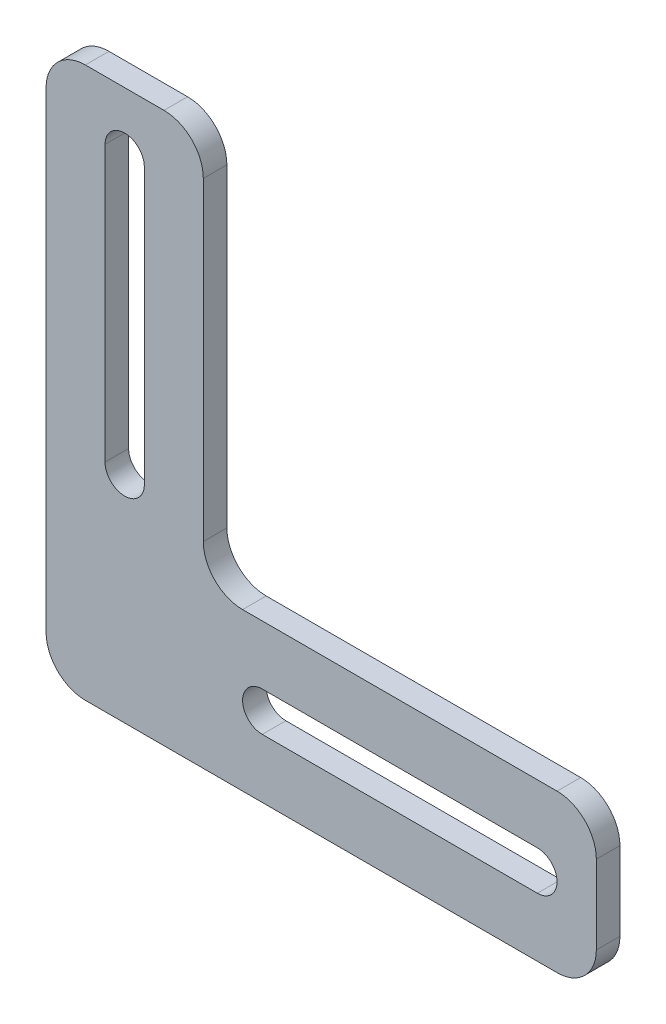
ISO-10303-21;
HEADER;
FILE_DESCRIPTION(('STEP AP214'),'2;1');
FILE_NAME('part.step','',(''),(''),'','','');
FILE_SCHEMA(('AUTOMOTIVE_DESIGN { 1 0 10303 214 1 1 1 1 }'));
ENDSEC;
DATA;
#1=APPLICATION_CONTEXT('core data for automotive mechanical design processes');
#2=APPLICATION_PROTOCOL_DEFINITION('international standard','automotive_design',2000,#1);
#3=PRODUCT_CONTEXT('',#1,'mechanical');
#4=PRODUCT('Part','Part','',(#3));
#5=PRODUCT_RELATED_PRODUCT_CATEGORY('part','',(#4));
#6=PRODUCT_DEFINITION_FORMATION('','',#4);
#7=PRODUCT_DEFINITION_CONTEXT('part definition',#1,'design');
#8=PRODUCT_DEFINITION('design','',#6,#7);
#9=PRODUCT_DEFINITION_SHAPE('','',#8);
#10=(LENGTH_UNIT() NAMED_UNIT(*) SI_UNIT(.MILLI.,.METRE.));
#11=(NAMED_UNIT(*) PLANE_ANGLE_UNIT() SI_UNIT($,.RADIAN.));
#12=(NAMED_UNIT(*) SI_UNIT($,.STERADIAN.) SOLID_ANGLE_UNIT());
#13=UNCERTAINTY_MEASURE_WITH_UNIT(LENGTH_MEASURE(1.E-05),#10,'distance_accuracy_value','');
#14=(GEOMETRIC_REPRESENTATION_CONTEXT(3) GLOBAL_UNCERTAINTY_ASSIGNED_CONTEXT((#13)) GLOBAL_UNIT_ASSIGNED_CONTEXT((#10,
#11,#12)) REPRESENTATION_CONTEXT('',''));
#15=CARTESIAN_POINT('',(0.,0.,0.));
#16=DIRECTION('',(0.,0.,1.));
#17=DIRECTION('',(1.,0.,0.));
#18=AXIS2_PLACEMENT_3D('',#15,#16,#17);
#19=CARTESIAN_POINT('',(0.,0.,3.));
#20=DIRECTION('',(0.,0.,1.));
#21=DIRECTION('',(1.,0.,0.));
#22=AXIS2_PLACEMENT_3D('',#19,#20,#21);
#23=PLANE('',#22);
#24=DIRECTION('',(1.,0.,0.));
#25=VECTOR('',#24,1.);
#26=CARTESIAN_POINT('',(0.,0.,3.));
#27=LINE('',#26,#25);
#28=CARTESIAN_POINT('',(5.,0.,3.));
#29=VERTEX_POINT('',#28);
#30=CARTESIAN_POINT('',(65.,0.,3.));
#31=VERTEX_POINT('',#30);
#32=EDGE_CURVE('E250',#29,#31,#27,.T.);
#33=ORIENTED_EDGE('',*,*,#32,.T.);
#34=CARTESIAN_POINT('',(65.,5.,3.));
#35=DIRECTION('',(0.,0.,1.));
#36=DIRECTION('',(1.,0.,0.));
#37=AXIS2_PLACEMENT_3D('',#34,#35,#36);
#38=CIRCLE('',#37,5.);
#39=CARTESIAN_POINT('',(70.,5.,3.));
#40=VERTEX_POINT('',#39);
#41=EDGE_CURVE('E314',#31,#40,#38,.T.);
#42=ORIENTED_EDGE('',*,*,#41,.T.);
#43=DIRECTION('',(0.,1.,0.));
#44=VECTOR('',#43,1.);
#45=CARTESIAN_POINT('',(70.,0.,3.));
#46=LINE('',#45,#44);
#47=CARTESIAN_POINT('',(70.,15.,3.));
#48=VERTEX_POINT('',#47);
#49=EDGE_CURVE('E253',#40,#48,#46,.T.);
#50=ORIENTED_EDGE('',*,*,#49,.T.);
#51=CARTESIAN_POINT('',(65.,15.,3.));
#52=DIRECTION('',(0.,0.,1.));
#53=DIRECTION('',(1.,0.,0.));
#54=AXIS2_PLACEMENT_3D('',#51,#52,#53);
#55=CIRCLE('',#54,5.);
#56=CARTESIAN_POINT('',(65.,20.,3.));
#57=VERTEX_POINT('',#56);
#58=EDGE_CURVE('E312',#48,#57,#55,.T.);
#59=ORIENTED_EDGE('',*,*,#58,.T.);
#60=DIRECTION('',(-1.,0.,0.));
#61=VECTOR('',#60,1.);
#62=CARTESIAN_POINT('',(70.,20.,3.));
#63=LINE('',#62,#61);
#64=CARTESIAN_POINT('',(25.,20.,3.));
#65=VERTEX_POINT('',#64);
#66=EDGE_CURVE('E256',#57,#65,#63,.T.);
#67=ORIENTED_EDGE('',*,*,#66,.T.);
#68=CARTESIAN_POINT('',(25.,25.,3.));
#69=DIRECTION('',(0.,0.,1.));
#70=DIRECTION('',(1.,0.,0.));
#71=AXIS2_PLACEMENT_3D('',#68,#69,#70);
#72=CIRCLE('',#71,5.);
#73=CARTESIAN_POINT('',(20.,25.,3.));
#74=VERTEX_POINT('',#73);
#75=EDGE_CURVE('E12',#65,#74,#72,.F.);
#76=ORIENTED_EDGE('',*,*,#75,.T.);
#77=DIRECTION('',(0.,1.,0.));
#78=VECTOR('',#77,1.);
#79=CARTESIAN_POINT('',(20.,20.,3.));
#80=LINE('',#79,#78);
#81=CARTESIAN_POINT('',(20.,65.,3.));
#82=VERTEX_POINT('',#81);
#83=EDGE_CURVE('E259',#74,#82,#80,.T.);
#84=ORIENTED_EDGE('',*,*,#83,.T.);
#85=CARTESIAN_POINT('',(15.,65.,3.));
#86=DIRECTION('',(0.,0.,1.));
#87=DIRECTION('',(1.,0.,0.));
#88=AXIS2_PLACEMENT_3D('',#85,#86,#87);
#89=CIRCLE('',#88,5.);
#90=CARTESIAN_POINT('',(15.,70.,3.));
#91=VERTEX_POINT('',#90);
#92=EDGE_CURVE('E307',#82,#91,#89,.T.);
#93=ORIENTED_EDGE('',*,*,#92,.T.);
#94=DIRECTION('',(-1.,0.,0.));
#95=VECTOR('',#94,1.);
#96=CARTESIAN_POINT('',(20.,70.,3.));
#97=LINE('',#96,#95);
#98=CARTESIAN_POINT('',(5.,70.,3.));
#99=VERTEX_POINT('',#98);
#100=EDGE_CURVE('E245',#91,#99,#97,.T.);
#101=ORIENTED_EDGE('',*,*,#100,.T.);
#102=CARTESIAN_POINT('',(5.,65.,3.));
#103=DIRECTION('',(0.,0.,1.));
#104=DIRECTION('',(1.,0.,0.));
#105=AXIS2_PLACEMENT_3D('',#102,#103,#104);
#106=CIRCLE('',#105,5.);
#107=CARTESIAN_POINT('',(0.,65.,3.));
#108=VERTEX_POINT('',#107);
#109=EDGE_CURVE('E56',#99,#108,#106,.T.);
#110=ORIENTED_EDGE('',*,*,#109,.T.);
#111=DIRECTION('',(0.,-1.,0.));
#112=VECTOR('',#111,1.);
#113=CARTESIAN_POINT('',(0.,70.,3.));
#114=LINE('',#113,#112);
#115=CARTESIAN_POINT('',(0.,5.,3.));
#116=VERTEX_POINT('',#115);
#117=EDGE_CURVE('E247',#108,#116,#114,.T.);
#118=ORIENTED_EDGE('',*,*,#117,.T.);
#119=CARTESIAN_POINT('',(5.,5.,3.));
#120=DIRECTION('',(0.,0.,1.));
#121=DIRECTION('',(1.,0.,0.));
#122=AXIS2_PLACEMENT_3D('',#119,#120,#121);
#123=CIRCLE('',#122,5.);
#124=EDGE_CURVE('E310',#116,#29,#123,.T.);
#125=ORIENTED_EDGE('',*,*,#124,.T.);
#126=EDGE_LOOP('',(#33,#42,#50,#59,#67,#76,#84,#93,#101,#110,#118,#125));
#127=FACE_BOUND('',#126,.T.);
#128=DIRECTION('',(0.,-1.,0.));
#129=VECTOR('',#128,1.);
#130=CARTESIAN_POINT('',(7.49999999999999,62.5,3.));
#131=LINE('',#130,#129);
#132=CARTESIAN_POINT('',(7.49999999999999,62.5,3.));
#133=VERTEX_POINT('',#132);
#134=CARTESIAN_POINT('',(7.5,27.5,3.));
#135=VERTEX_POINT('',#134);
#136=EDGE_CURVE('E216',#133,#135,#131,.T.);
#137=ORIENTED_EDGE('',*,*,#136,.F.);
#138=CARTESIAN_POINT('',(10.,62.5,3.));
#139=DIRECTION('',(0.,0.,1.));
#140=DIRECTION('',(1.,0.,0.));
#141=AXIS2_PLACEMENT_3D('',#138,#139,#140);
#142=CIRCLE('',#141,2.5);
#143=CARTESIAN_POINT('',(12.5,62.5,3.));
#144=VERTEX_POINT('',#143);
#145=EDGE_CURVE('E214',#144,#133,#142,.T.);
#146=ORIENTED_EDGE('',*,*,#145,.F.);
#147=DIRECTION('',(0.,1.,0.));
#148=VECTOR('',#147,1.);
#149=CARTESIAN_POINT('',(12.5,62.5,3.));
#150=LINE('',#149,#148);
#151=CARTESIAN_POINT('',(12.5,27.5,3.));
#152=VERTEX_POINT('',#151);
#153=EDGE_CURVE('E222',#152,#144,#150,.T.);
#154=ORIENTED_EDGE('',*,*,#153,.F.);
#155=CARTESIAN_POINT('',(10.,27.5,3.));
#156=DIRECTION('',(0.,0.,1.));
#157=DIRECTION('',(1.,0.,0.));
#158=AXIS2_PLACEMENT_3D('',#155,#156,#157);
#159=CIRCLE('',#158,2.5);
#160=EDGE_CURVE('E219',#135,#152,#159,.T.);
#161=ORIENTED_EDGE('',*,*,#160,.F.);
#162=EDGE_LOOP('',(#137,#146,#154,#161));
#163=FACE_BOUND('',#162,.T.);
#164=DIRECTION('',(-1.,0.,0.));
#165=VECTOR('',#164,1.);
#166=CARTESIAN_POINT('',(62.5,12.5,3.));
#167=LINE('',#166,#165);
#168=CARTESIAN_POINT('',(62.5,12.5,3.));
#169=VERTEX_POINT('',#168);
#170=CARTESIAN_POINT('',(27.5,12.5,3.));
#171=VERTEX_POINT('',#170);
#172=EDGE_CURVE('E183',#169,#171,#167,.T.);
#173=ORIENTED_EDGE('',*,*,#172,.F.);
#174=CARTESIAN_POINT('',(62.5,10.,3.));
#175=DIRECTION('',(0.,0.,1.));
#176=DIRECTION('',(1.,0.,0.));
#177=AXIS2_PLACEMENT_3D('',#174,#175,#176);
#178=CIRCLE('',#177,2.5);
#179=CARTESIAN_POINT('',(62.5,7.5,3.));
#180=VERTEX_POINT('',#179);
#181=EDGE_CURVE('E173',#180,#169,#178,.T.);
#182=ORIENTED_EDGE('',*,*,#181,.F.);
#183=DIRECTION('',(1.,0.,0.));
#184=VECTOR('',#183,1.);
#185=CARTESIAN_POINT('',(62.5,7.5,3.));
#186=LINE('',#185,#184);
#187=CARTESIAN_POINT('',(27.5,7.5,3.));
#188=VERTEX_POINT('',#187);
#189=EDGE_CURVE('E198',#188,#180,#186,.T.);
#190=ORIENTED_EDGE('',*,*,#189,.F.);
#191=CARTESIAN_POINT('',(27.5,10.,3.));
#192=DIRECTION('',(0.,0.,1.));
#193=DIRECTION('',(1.,0.,0.));
#194=AXIS2_PLACEMENT_3D('',#191,#192,#193);
#195=CIRCLE('',#194,2.5);
#196=EDGE_CURVE('E196',#171,#188,#195,.T.);
#197=ORIENTED_EDGE('',*,*,#196,.F.);
#198=EDGE_LOOP('',(#173,#182,#190,#197));
#199=FACE_BOUND('',#198,.T.);
#200=ADVANCED_FACE('F34',(#127,#163,#199),#23,.T.);
#201=CARTESIAN_POINT('',(0.,0.,0.));
#202=DIRECTION('',(0.,0.,1.));
#203=DIRECTION('',(1.,0.,0.));
#204=AXIS2_PLACEMENT_3D('',#201,#202,#203);
#205=PLANE('',#204);
#206=CARTESIAN_POINT('',(10.,62.5,0.));
#207=DIRECTION('',(0.,0.,1.));
#208=DIRECTION('',(1.,0.,0.));
#209=AXIS2_PLACEMENT_3D('',#206,#207,#208);
#210=CIRCLE('',#209,2.5);
#211=CARTESIAN_POINT('',(12.5,62.5,0.));
#212=VERTEX_POINT('',#211);
#213=CARTESIAN_POINT('',(7.49999999999999,62.5,0.));
#214=VERTEX_POINT('',#213);
#215=EDGE_CURVE('E191',#212,#214,#210,.T.);
#216=ORIENTED_EDGE('',*,*,#215,.T.);
#217=DIRECTION('',(0.,-1.,0.));
#218=VECTOR('',#217,1.);
#219=CARTESIAN_POINT('',(7.49999999999999,62.5,0.));
#220=LINE('',#219,#218);
#221=CARTESIAN_POINT('',(7.5,27.5,0.));
#222=VERTEX_POINT('',#221);
#223=EDGE_CURVE('E227',#214,#222,#220,.T.);
#224=ORIENTED_EDGE('',*,*,#223,.T.);
#225=CARTESIAN_POINT('',(10.,27.5,0.));
#226=DIRECTION('',(0.,0.,1.));
#227=DIRECTION('',(1.,0.,0.));
#228=AXIS2_PLACEMENT_3D('',#225,#226,#227);
#229=CIRCLE('',#228,2.5);
#230=CARTESIAN_POINT('',(12.5,27.5,0.));
#231=VERTEX_POINT('',#230);
#232=EDGE_CURVE('E230',#222,#231,#229,.T.);
#233=ORIENTED_EDGE('',*,*,#232,.T.);
#234=DIRECTION('',(0.,1.,0.));
#235=VECTOR('',#234,1.);
#236=CARTESIAN_POINT('',(12.5,62.5,0.));
#237=LINE('',#236,#235);
#238=EDGE_CURVE('E217',#231,#212,#237,.T.);
#239=ORIENTED_EDGE('',*,*,#238,.T.);
#240=EDGE_LOOP('',(#216,#224,#233,#239));
#241=FACE_BOUND('',#240,.T.);
#242=DIRECTION('',(0.,1.,0.));
#243=VECTOR('',#242,1.);
#244=CARTESIAN_POINT('',(70.,0.,0.));
#245=LINE('',#244,#243);
#246=CARTESIAN_POINT('',(70.,5.,0.));
#247=VERTEX_POINT('',#246);
#248=CARTESIAN_POINT('',(70.,15.,0.));
#249=VERTEX_POINT('',#248);
#250=EDGE_CURVE('E270',#247,#249,#245,.T.);
#251=ORIENTED_EDGE('',*,*,#250,.F.);
#252=CARTESIAN_POINT('',(65.,5.,0.));
#253=DIRECTION('',(0.,0.,1.));
#254=DIRECTION('',(1.,0.,0.));
#255=AXIS2_PLACEMENT_3D('',#252,#253,#254);
#256=CIRCLE('',#255,5.);
#257=CARTESIAN_POINT('',(65.,0.,0.));
#258=VERTEX_POINT('',#257);
#259=EDGE_CURVE('E300',#247,#258,#256,.F.);
#260=ORIENTED_EDGE('',*,*,#259,.T.);
#261=DIRECTION('',(1.,0.,0.));
#262=VECTOR('',#261,1.);
#263=CARTESIAN_POINT('',(0.,0.,0.));
#264=LINE('',#263,#262);
#265=CARTESIAN_POINT('',(5.,0.,0.));
#266=VERTEX_POINT('',#265);
#267=EDGE_CURVE('E267',#266,#258,#264,.T.);
#268=ORIENTED_EDGE('',*,*,#267,.F.);
#269=CARTESIAN_POINT('',(5.,5.,0.));
#270=DIRECTION('',(0.,0.,1.));
#271=DIRECTION('',(1.,0.,0.));
#272=AXIS2_PLACEMENT_3D('',#269,#270,#271);
#273=CIRCLE('',#272,5.);
#274=CARTESIAN_POINT('',(0.,5.,0.));
#275=VERTEX_POINT('',#274);
#276=EDGE_CURVE('E296',#266,#275,#273,.F.);
#277=ORIENTED_EDGE('',*,*,#276,.T.);
#278=DIRECTION('',(0.,-1.,0.));
#279=VECTOR('',#278,1.);
#280=CARTESIAN_POINT('',(0.,70.,0.));
#281=LINE('',#280,#279);
#282=CARTESIAN_POINT('',(0.,65.,0.));
#283=VERTEX_POINT('',#282);
#284=EDGE_CURVE('E265',#283,#275,#281,.T.);
#285=ORIENTED_EDGE('',*,*,#284,.F.);
#286=CARTESIAN_POINT('',(5.,65.,0.));
#287=DIRECTION('',(0.,0.,1.));
#288=DIRECTION('',(1.,0.,0.));
#289=AXIS2_PLACEMENT_3D('',#286,#287,#288);
#290=CIRCLE('',#289,5.);
#291=CARTESIAN_POINT('',(5.,70.,0.));
#292=VERTEX_POINT('',#291);
#293=EDGE_CURVE('E294',#283,#292,#290,.F.);
#294=ORIENTED_EDGE('',*,*,#293,.T.);
#295=DIRECTION('',(-1.,0.,0.));
#296=VECTOR('',#295,1.);
#297=CARTESIAN_POINT('',(20.,70.,0.));
#298=LINE('',#297,#296);
#299=CARTESIAN_POINT('',(15.,70.,0.));
#300=VERTEX_POINT('',#299);
#301=EDGE_CURVE('E244',#300,#292,#298,.T.);
#302=ORIENTED_EDGE('',*,*,#301,.F.);
#303=CARTESIAN_POINT('',(15.,65.,0.));
#304=DIRECTION('',(0.,0.,1.));
#305=DIRECTION('',(1.,0.,0.));
#306=AXIS2_PLACEMENT_3D('',#303,#304,#305);
#307=CIRCLE('',#306,5.);
#308=CARTESIAN_POINT('',(20.,65.,0.));
#309=VERTEX_POINT('',#308);
#310=EDGE_CURVE('E292',#300,#309,#307,.F.);
#311=ORIENTED_EDGE('',*,*,#310,.T.);
#312=DIRECTION('',(0.,1.,0.));
#313=VECTOR('',#312,1.);
#314=CARTESIAN_POINT('',(20.,20.,0.));
#315=LINE('',#314,#313);
#316=CARTESIAN_POINT('',(20.,25.,0.));
#317=VERTEX_POINT('',#316);
#318=EDGE_CURVE('E248',#317,#309,#315,.T.);
#319=ORIENTED_EDGE('',*,*,#318,.F.);
#320=CARTESIAN_POINT('',(25.,25.,0.));
#321=DIRECTION('',(0.,0.,1.));
#322=DIRECTION('',(1.,0.,0.));
#323=AXIS2_PLACEMENT_3D('',#320,#321,#322);
#324=CIRCLE('',#323,5.);
#325=CARTESIAN_POINT('',(25.,20.,0.));
#326=VERTEX_POINT('',#325);
#327=EDGE_CURVE('E42',#317,#326,#324,.T.);
#328=ORIENTED_EDGE('',*,*,#327,.T.);
#329=DIRECTION('',(-1.,0.,0.));
#330=VECTOR('',#329,1.);
#331=CARTESIAN_POINT('',(70.,20.,0.));
#332=LINE('',#331,#330);
#333=CARTESIAN_POINT('',(65.,20.,0.));
#334=VERTEX_POINT('',#333);
#335=EDGE_CURVE('E273',#334,#326,#332,.T.);
#336=ORIENTED_EDGE('',*,*,#335,.F.);
#337=CARTESIAN_POINT('',(65.,15.,0.));
#338=DIRECTION('',(0.,0.,1.));
#339=DIRECTION('',(1.,0.,0.));
#340=AXIS2_PLACEMENT_3D('',#337,#338,#339);
#341=CIRCLE('',#340,5.);
#342=EDGE_CURVE('E298',#334,#249,#341,.F.);
#343=ORIENTED_EDGE('',*,*,#342,.T.);
#344=EDGE_LOOP('',(#251,#260,#268,#277,#285,#294,#302,#311,#319,#328,#336,#343));
#345=FACE_BOUND('',#344,.T.);
#346=CARTESIAN_POINT('',(62.5,10.,0.));
#347=DIRECTION('',(0.,0.,1.));
#348=DIRECTION('',(1.,0.,0.));
#349=AXIS2_PLACEMENT_3D('',#346,#347,#348);
#350=CIRCLE('',#349,2.5);
#351=CARTESIAN_POINT('',(62.5,7.5,0.));
#352=VERTEX_POINT('',#351);
#353=CARTESIAN_POINT('',(62.5,12.5,0.));
#354=VERTEX_POINT('',#353);
#355=EDGE_CURVE('E202',#352,#354,#350,.T.);
#356=ORIENTED_EDGE('',*,*,#355,.T.);
#357=DIRECTION('',(-1.,0.,0.));
#358=VECTOR('',#357,1.);
#359=CARTESIAN_POINT('',(62.5,12.5,0.));
#360=LINE('',#359,#358);
#361=CARTESIAN_POINT('',(27.5,12.5,0.));
#362=VERTEX_POINT('',#361);
#363=EDGE_CURVE('E190',#354,#362,#360,.T.);
#364=ORIENTED_EDGE('',*,*,#363,.T.);
#365=CARTESIAN_POINT('',(27.5,10.,0.));
#366=DIRECTION('',(0.,0.,1.));
#367=DIRECTION('',(1.,0.,0.));
#368=AXIS2_PLACEMENT_3D('',#365,#366,#367);
#369=CIRCLE('',#368,2.5);
#370=CARTESIAN_POINT('',(27.5,7.5,0.));
#371=VERTEX_POINT('',#370);
#372=EDGE_CURVE('E205',#362,#371,#369,.T.);
#373=ORIENTED_EDGE('',*,*,#372,.T.);
#374=DIRECTION('',(1.,0.,0.));
#375=VECTOR('',#374,1.);
#376=CARTESIAN_POINT('',(62.5,7.5,0.));
#377=LINE('',#376,#375);
#378=EDGE_CURVE('E184',#371,#352,#377,.T.);
#379=ORIENTED_EDGE('',*,*,#378,.T.);
#380=EDGE_LOOP('',(#356,#364,#373,#379));
#381=FACE_BOUND('',#380,.T.);
#382=ADVANCED_FACE('F328',(#241,#345,#381),#205,.F.);
#383=CARTESIAN_POINT('',(20.,70.,3.));
#384=DIRECTION('',(0.,-1.,0.));
#385=DIRECTION('',(0.,0.,-1.));
#386=AXIS2_PLACEMENT_3D('',#383,#384,#385);
#387=PLANE('',#386);
#388=ORIENTED_EDGE('',*,*,#301,.T.);
#389=DIRECTION('',(0.,0.,-1.));
#390=VECTOR('',#389,1.);
#391=CARTESIAN_POINT('',(5.,70.,3.));
#392=LINE('',#391,#390);
#393=EDGE_CURVE('E323',#292,#99,#392,.F.);
#394=ORIENTED_EDGE('',*,*,#393,.T.);
#395=ORIENTED_EDGE('',*,*,#100,.F.);
#396=DIRECTION('',(0.,0.,-1.));
#397=VECTOR('',#396,1.);
#398=CARTESIAN_POINT('',(15.,70.,3.));
#399=LINE('',#398,#397);
#400=EDGE_CURVE('E320',#91,#300,#399,.T.);
#401=ORIENTED_EDGE('',*,*,#400,.T.);
#402=EDGE_LOOP('',(#388,#394,#395,#401));
#403=FACE_BOUND('',#402,.T.);
#404=ADVANCED_FACE('F349',(#403),#387,.F.);
#405=CARTESIAN_POINT('',(0.,70.,3.));
#406=DIRECTION('',(1.,0.,0.));
#407=DIRECTION('',(0.,1.,0.));
#408=AXIS2_PLACEMENT_3D('',#405,#406,#407);
#409=PLANE('',#408);
#410=ORIENTED_EDGE('',*,*,#284,.T.);
#411=DIRECTION('',(0.,0.,-1.));
#412=VECTOR('',#411,1.);
#413=CARTESIAN_POINT('',(0.,5.,3.));
#414=LINE('',#413,#412);
#415=EDGE_CURVE('E49',#275,#116,#414,.F.);
#416=ORIENTED_EDGE('',*,*,#415,.T.);
#417=ORIENTED_EDGE('',*,*,#117,.F.);
#418=DIRECTION('',(0.,0.,-1.));
#419=VECTOR('',#418,1.);
#420=CARTESIAN_POINT('',(0.,65.,3.));
#421=LINE('',#420,#419);
#422=EDGE_CURVE('E316',#108,#283,#421,.T.);
#423=ORIENTED_EDGE('',*,*,#422,.T.);
#424=EDGE_LOOP('',(#410,#416,#417,#423));
#425=FACE_BOUND('',#424,.T.);
#426=ADVANCED_FACE('F356',(#425),#409,.F.);
#427=CARTESIAN_POINT('',(0.,0.,3.));
#428=DIRECTION('',(0.,1.,0.));
#429=DIRECTION('',(0.,0.,1.));
#430=AXIS2_PLACEMENT_3D('',#427,#428,#429);
#431=PLANE('',#430);
#432=ORIENTED_EDGE('',*,*,#267,.T.);
#433=DIRECTION('',(0.,0.,-1.));
#434=VECTOR('',#433,1.);
#435=CARTESIAN_POINT('',(65.,0.,3.));
#436=LINE('',#435,#434);
#437=EDGE_CURVE('E305',#258,#31,#436,.F.);
#438=ORIENTED_EDGE('',*,*,#437,.T.);
#439=ORIENTED_EDGE('',*,*,#32,.F.);
#440=DIRECTION('',(0.,0.,-1.));
#441=VECTOR('',#440,1.);
#442=CARTESIAN_POINT('',(5.,0.,3.));
#443=LINE('',#442,#441);
#444=EDGE_CURVE('E302',#29,#266,#443,.T.);
#445=ORIENTED_EDGE('',*,*,#444,.T.);
#446=EDGE_LOOP('',(#432,#438,#439,#445));
#447=FACE_BOUND('',#446,.T.);
#448=ADVANCED_FACE('F364',(#447),#431,.F.);
#449=CARTESIAN_POINT('',(70.,0.,3.));
#450=DIRECTION('',(-1.,0.,0.));
#451=DIRECTION('',(0.,0.,1.));
#452=AXIS2_PLACEMENT_3D('',#449,#450,#451);
#453=PLANE('',#452);
#454=ORIENTED_EDGE('',*,*,#49,.F.);
#455=DIRECTION('',(0.,0.,-1.));
#456=VECTOR('',#455,1.);
#457=CARTESIAN_POINT('',(70.,5.,3.));
#458=LINE('',#457,#456);
#459=EDGE_CURVE('E289',#40,#247,#458,.T.);
#460=ORIENTED_EDGE('',*,*,#459,.T.);
#461=ORIENTED_EDGE('',*,*,#250,.T.);
#462=DIRECTION('',(0.,0.,-1.));
#463=VECTOR('',#462,1.);
#464=CARTESIAN_POINT('',(70.,15.,3.));
#465=LINE('',#464,#463);
#466=EDGE_CURVE('E287',#249,#48,#465,.F.);
#467=ORIENTED_EDGE('',*,*,#466,.T.);
#468=EDGE_LOOP('',(#454,#460,#461,#467));
#469=FACE_BOUND('',#468,.T.);
#470=ADVANCED_FACE('F372',(#469),#453,.F.);
#471=CARTESIAN_POINT('',(70.,20.,3.));
#472=DIRECTION('',(0.,-1.,0.));
#473=DIRECTION('',(1.,0.,0.));
#474=AXIS2_PLACEMENT_3D('',#471,#472,#473);
#475=PLANE('',#474);
#476=ORIENTED_EDGE('',*,*,#335,.T.);
#477=DIRECTION('',(0.,0.,-1.));
#478=VECTOR('',#477,1.);
#479=CARTESIAN_POINT('',(25.,20.,3.));
#480=LINE('',#479,#478);
#481=EDGE_CURVE('E285',#326,#65,#480,.F.);
#482=ORIENTED_EDGE('',*,*,#481,.T.);
#483=ORIENTED_EDGE('',*,*,#66,.F.);
#484=DIRECTION('',(0.,0.,-1.));
#485=VECTOR('',#484,1.);
#486=CARTESIAN_POINT('',(65.,20.,3.));
#487=LINE('',#486,#485);
#488=EDGE_CURVE('E282',#57,#334,#487,.T.);
#489=ORIENTED_EDGE('',*,*,#488,.T.);
#490=EDGE_LOOP('',(#476,#482,#483,#489));
#491=FACE_BOUND('',#490,.T.);
#492=ADVANCED_FACE('F334',(#491),#475,.F.);
#493=CARTESIAN_POINT('',(20.,20.,3.));
#494=DIRECTION('',(-1.,0.,0.));
#495=DIRECTION('',(0.,-1.,0.));
#496=AXIS2_PLACEMENT_3D('',#493,#494,#495);
#497=PLANE('',#496);
#498=ORIENTED_EDGE('',*,*,#83,.F.);
#499=DIRECTION('',(0.,0.,-1.));
#500=VECTOR('',#499,1.);
#501=CARTESIAN_POINT('',(20.,25.,0.));
#502=LINE('',#501,#500);
#503=EDGE_CURVE('E279',#74,#317,#502,.T.);
#504=ORIENTED_EDGE('',*,*,#503,.T.);
#505=ORIENTED_EDGE('',*,*,#318,.T.);
#506=DIRECTION('',(0.,0.,-1.));
#507=VECTOR('',#506,1.);
#508=CARTESIAN_POINT('',(20.,65.,3.));
#509=LINE('',#508,#507);
#510=EDGE_CURVE('E262',#309,#82,#509,.F.);
#511=ORIENTED_EDGE('',*,*,#510,.T.);
#512=EDGE_LOOP('',(#498,#504,#505,#511));
#513=FACE_BOUND('',#512,.T.);
#514=ADVANCED_FACE('F343',(#513),#497,.F.);
#515=CARTESIAN_POINT('',(10.,62.5,3.));
#516=DIRECTION('',(0.,0.,-1.));
#517=DIRECTION('',(-1.,0.,0.));
#518=AXIS2_PLACEMENT_3D('',#515,#516,#517);
#519=CYLINDRICAL_SURFACE('',#518,2.5);
#520=ORIENTED_EDGE('',*,*,#215,.F.);
#521=DIRECTION('',(0.,0.,-1.));
#522=VECTOR('',#521,1.);
#523=CARTESIAN_POINT('',(12.5,62.5,3.));
#524=LINE('',#523,#522);
#525=EDGE_CURVE('E224',#144,#212,#524,.T.);
#526=ORIENTED_EDGE('',*,*,#525,.F.);
#527=ORIENTED_EDGE('',*,*,#145,.T.);
#528=DIRECTION('',(0.,0.,-1.));
#529=VECTOR('',#528,1.);
#530=CARTESIAN_POINT('',(7.49999999999999,62.5,3.));
#531=LINE('',#530,#529);
#532=EDGE_CURVE('E241',#133,#214,#531,.T.);
#533=ORIENTED_EDGE('',*,*,#532,.T.);
#534=EDGE_LOOP('',(#520,#526,#527,#533));
#535=FACE_BOUND('',#534,.T.);
#536=ADVANCED_FACE('F393',(#535),#519,.F.);
#537=CARTESIAN_POINT('',(7.49999999999999,62.5,3.));
#538=DIRECTION('',(1.,0.,0.));
#539=DIRECTION('',(0.,1.,0.));
#540=AXIS2_PLACEMENT_3D('',#537,#538,#539);
#541=PLANE('',#540);
#542=ORIENTED_EDGE('',*,*,#223,.F.);
#543=ORIENTED_EDGE('',*,*,#532,.F.);
#544=ORIENTED_EDGE('',*,*,#136,.T.);
#545=DIRECTION('',(0.,0.,-1.));
#546=VECTOR('',#545,1.);
#547=CARTESIAN_POINT('',(7.5,27.5,3.));
#548=LINE('',#547,#546);
#549=EDGE_CURVE('E239',#135,#222,#548,.T.);
#550=ORIENTED_EDGE('',*,*,#549,.T.);
#551=EDGE_LOOP('',(#542,#543,#544,#550));
#552=FACE_BOUND('',#551,.T.);
#553=ADVANCED_FACE('F433',(#552),#541,.T.);
#554=CARTESIAN_POINT('',(10.,27.5,3.));
#555=DIRECTION('',(0.,0.,-1.));
#556=DIRECTION('',(-1.,0.,0.));
#557=AXIS2_PLACEMENT_3D('',#554,#555,#556);
#558=CYLINDRICAL_SURFACE('',#557,2.5);
#559=ORIENTED_EDGE('',*,*,#232,.F.);
#560=ORIENTED_EDGE('',*,*,#549,.F.);
#561=ORIENTED_EDGE('',*,*,#160,.T.);
#562=DIRECTION('',(0.,0.,-1.));
#563=VECTOR('',#562,1.);
#564=CARTESIAN_POINT('',(12.5,27.5,3.));
#565=LINE('',#564,#563);
#566=EDGE_CURVE('E237',#152,#231,#565,.T.);
#567=ORIENTED_EDGE('',*,*,#566,.T.);
#568=EDGE_LOOP('',(#559,#560,#561,#567));
#569=FACE_BOUND('',#568,.T.);
#570=ADVANCED_FACE('F430',(#569),#558,.F.);
#571=CARTESIAN_POINT('',(12.5,62.5,3.));
#572=DIRECTION('',(-1.,0.,0.));
#573=DIRECTION('',(0.,-1.,0.));
#574=AXIS2_PLACEMENT_3D('',#571,#572,#573);
#575=PLANE('',#574);
#576=ORIENTED_EDGE('',*,*,#238,.F.);
#577=ORIENTED_EDGE('',*,*,#566,.F.);
#578=ORIENTED_EDGE('',*,*,#153,.T.);
#579=ORIENTED_EDGE('',*,*,#525,.T.);
#580=EDGE_LOOP('',(#576,#577,#578,#579));
#581=FACE_BOUND('',#580,.T.);
#582=ADVANCED_FACE('F427',(#581),#575,.T.);
#583=CARTESIAN_POINT('',(62.5,10.,3.));
#584=DIRECTION('',(0.,0.,-1.));
#585=DIRECTION('',(-1.,0.,0.));
#586=AXIS2_PLACEMENT_3D('',#583,#584,#585);
#587=CYLINDRICAL_SURFACE('',#586,2.5);
#588=ORIENTED_EDGE('',*,*,#355,.F.);
#589=DIRECTION('',(0.,0.,-1.));
#590=VECTOR('',#589,1.);
#591=CARTESIAN_POINT('',(62.5,7.5,3.));
#592=LINE('',#591,#590);
#593=EDGE_CURVE('E179',#180,#352,#592,.T.);
#594=ORIENTED_EDGE('',*,*,#593,.F.);
#595=ORIENTED_EDGE('',*,*,#181,.T.);
#596=DIRECTION('',(0.,0.,-1.));
#597=VECTOR('',#596,1.);
#598=CARTESIAN_POINT('',(62.5,12.5,3.));
#599=LINE('',#598,#597);
#600=EDGE_CURVE('E176',#169,#354,#599,.T.);
#601=ORIENTED_EDGE('',*,*,#600,.T.);
#602=EDGE_LOOP('',(#588,#594,#595,#601));
#603=FACE_BOUND('',#602,.T.);
#604=ADVANCED_FACE('F175',(#603),#587,.F.);
#605=CARTESIAN_POINT('',(62.5,12.5,3.));
#606=DIRECTION('',(0.,-1.,0.));
#607=DIRECTION('',(1.,0.,0.));
#608=AXIS2_PLACEMENT_3D('',#605,#606,#607);
#609=PLANE('',#608);
#610=ORIENTED_EDGE('',*,*,#363,.F.);
#611=ORIENTED_EDGE('',*,*,#600,.F.);
#612=ORIENTED_EDGE('',*,*,#172,.T.);
#613=DIRECTION('',(0.,0.,-1.));
#614=VECTOR('',#613,1.);
#615=CARTESIAN_POINT('',(27.5,12.5,3.));
#616=LINE('',#615,#614);
#617=EDGE_CURVE('E192',#171,#362,#616,.T.);
#618=ORIENTED_EDGE('',*,*,#617,.T.);
#619=EDGE_LOOP('',(#610,#611,#612,#618));
#620=FACE_BOUND('',#619,.T.);
#621=ADVANCED_FACE('F187',(#620),#609,.T.);
#622=CARTESIAN_POINT('',(27.5,10.,3.));
#623=DIRECTION('',(0.,0.,-1.));
#624=DIRECTION('',(-1.,0.,0.));
#625=AXIS2_PLACEMENT_3D('',#622,#623,#624);
#626=CYLINDRICAL_SURFACE('',#625,2.5);
#627=ORIENTED_EDGE('',*,*,#372,.F.);
#628=ORIENTED_EDGE('',*,*,#617,.F.);
#629=ORIENTED_EDGE('',*,*,#196,.T.);
#630=DIRECTION('',(0.,0.,-1.));
#631=VECTOR('',#630,1.);
#632=CARTESIAN_POINT('',(27.5,7.5,3.));
#633=LINE('',#632,#631);
#634=EDGE_CURVE('E211',#188,#371,#633,.T.);
#635=ORIENTED_EDGE('',*,*,#634,.T.);
#636=EDGE_LOOP('',(#627,#628,#629,#635));
#637=FACE_BOUND('',#636,.T.);
#638=ADVANCED_FACE('F413',(#637),#626,.F.);
#639=CARTESIAN_POINT('',(62.5,7.5,3.));
#640=DIRECTION('',(0.,1.,0.));
#641=DIRECTION('',(-1.,0.,0.));
#642=AXIS2_PLACEMENT_3D('',#639,#640,#641);
#643=PLANE('',#642);
#644=ORIENTED_EDGE('',*,*,#378,.F.);
#645=ORIENTED_EDGE('',*,*,#634,.F.);
#646=ORIENTED_EDGE('',*,*,#189,.T.);
#647=ORIENTED_EDGE('',*,*,#593,.T.);
#648=EDGE_LOOP('',(#644,#645,#646,#647));
#649=FACE_BOUND('',#648,.T.);
#650=ADVANCED_FACE('F409',(#649),#643,.T.);
#651=CARTESIAN_POINT('',(25.,25.,3.));
#652=DIRECTION('',(0.,0.,1.));
#653=DIRECTION('',(1.,0.,0.));
#654=AXIS2_PLACEMENT_3D('',#651,#652,#653);
#655=CYLINDRICAL_SURFACE('',#654,5.);
#656=ORIENTED_EDGE('',*,*,#75,.F.);
#657=ORIENTED_EDGE('',*,*,#481,.F.);
#658=ORIENTED_EDGE('',*,*,#327,.F.);
#659=ORIENTED_EDGE('',*,*,#503,.F.);
#660=EDGE_LOOP('',(#656,#657,#658,#659));
#661=FACE_BOUND('',#660,.T.);
#662=ADVANCED_FACE('F338',(#661),#655,.F.);
#663=CARTESIAN_POINT('',(65.,5.,3.));
#664=DIRECTION('',(0.,0.,-1.));
#665=DIRECTION('',(-1.,0.,0.));
#666=AXIS2_PLACEMENT_3D('',#663,#664,#665);
#667=CYLINDRICAL_SURFACE('',#666,5.);
#668=ORIENTED_EDGE('',*,*,#41,.F.);
#669=ORIENTED_EDGE('',*,*,#437,.F.);
#670=ORIENTED_EDGE('',*,*,#259,.F.);
#671=ORIENTED_EDGE('',*,*,#459,.F.);
#672=EDGE_LOOP('',(#668,#669,#670,#671));
#673=FACE_BOUND('',#672,.T.);
#674=ADVANCED_FACE('F370',(#673),#667,.T.);
#675=CARTESIAN_POINT('',(65.,15.,3.));
#676=DIRECTION('',(0.,0.,-1.));
#677=DIRECTION('',(-1.,0.,0.));
#678=AXIS2_PLACEMENT_3D('',#675,#676,#677);
#679=CYLINDRICAL_SURFACE('',#678,5.);
#680=ORIENTED_EDGE('',*,*,#58,.F.);
#681=ORIENTED_EDGE('',*,*,#466,.F.);
#682=ORIENTED_EDGE('',*,*,#342,.F.);
#683=ORIENTED_EDGE('',*,*,#488,.F.);
#684=EDGE_LOOP('',(#680,#681,#682,#683));
#685=FACE_BOUND('',#684,.T.);
#686=ADVANCED_FACE('F376',(#685),#679,.T.);
#687=CARTESIAN_POINT('',(5.,5.,3.));
#688=DIRECTION('',(0.,0.,-1.));
#689=DIRECTION('',(-1.,0.,0.));
#690=AXIS2_PLACEMENT_3D('',#687,#688,#689);
#691=CYLINDRICAL_SURFACE('',#690,5.);
#692=ORIENTED_EDGE('',*,*,#124,.F.);
#693=ORIENTED_EDGE('',*,*,#415,.F.);
#694=ORIENTED_EDGE('',*,*,#276,.F.);
#695=ORIENTED_EDGE('',*,*,#444,.F.);
#696=EDGE_LOOP('',(#692,#693,#694,#695));
#697=FACE_BOUND('',#696,.T.);
#698=ADVANCED_FACE('F361',(#697),#691,.T.);
#699=CARTESIAN_POINT('',(5.,65.,3.));
#700=DIRECTION('',(0.,0.,-1.));
#701=DIRECTION('',(-1.,0.,0.));
#702=AXIS2_PLACEMENT_3D('',#699,#700,#701);
#703=CYLINDRICAL_SURFACE('',#702,5.);
#704=ORIENTED_EDGE('',*,*,#109,.F.);
#705=ORIENTED_EDGE('',*,*,#393,.F.);
#706=ORIENTED_EDGE('',*,*,#293,.F.);
#707=ORIENTED_EDGE('',*,*,#422,.F.);
#708=EDGE_LOOP('',(#704,#705,#706,#707));
#709=FACE_BOUND('',#708,.T.);
#710=ADVANCED_FACE('F353',(#709),#703,.T.);
#711=CARTESIAN_POINT('',(15.,65.,3.));
#712=DIRECTION('',(0.,0.,-1.));
#713=DIRECTION('',(-1.,0.,0.));
#714=AXIS2_PLACEMENT_3D('',#711,#712,#713);
#715=CYLINDRICAL_SURFACE('',#714,5.);
#716=ORIENTED_EDGE('',*,*,#92,.F.);
#717=ORIENTED_EDGE('',*,*,#510,.F.);
#718=ORIENTED_EDGE('',*,*,#310,.F.);
#719=ORIENTED_EDGE('',*,*,#400,.F.);
#720=EDGE_LOOP('',(#716,#717,#718,#719));
#721=FACE_BOUND('',#720,.T.);
#722=ADVANCED_FACE('F36',(#721),#715,.T.);
#723=CLOSED_SHELL('',(#200,#382,#404,#426,#448,#470,#492,#514,#536,#553,#570,#582,#604,#621,
#638,#650,#662,#674,#686,#698,#710,#722));
#724=MANIFOLD_SOLID_BREP('B2',#723);
#725=ADVANCED_BREP_SHAPE_REPRESENTATION('',(#18,#724),#14);
#726=SHAPE_DEFINITION_REPRESENTATION(#9,#725);
ENDSEC;
END-ISO-10303-21;
